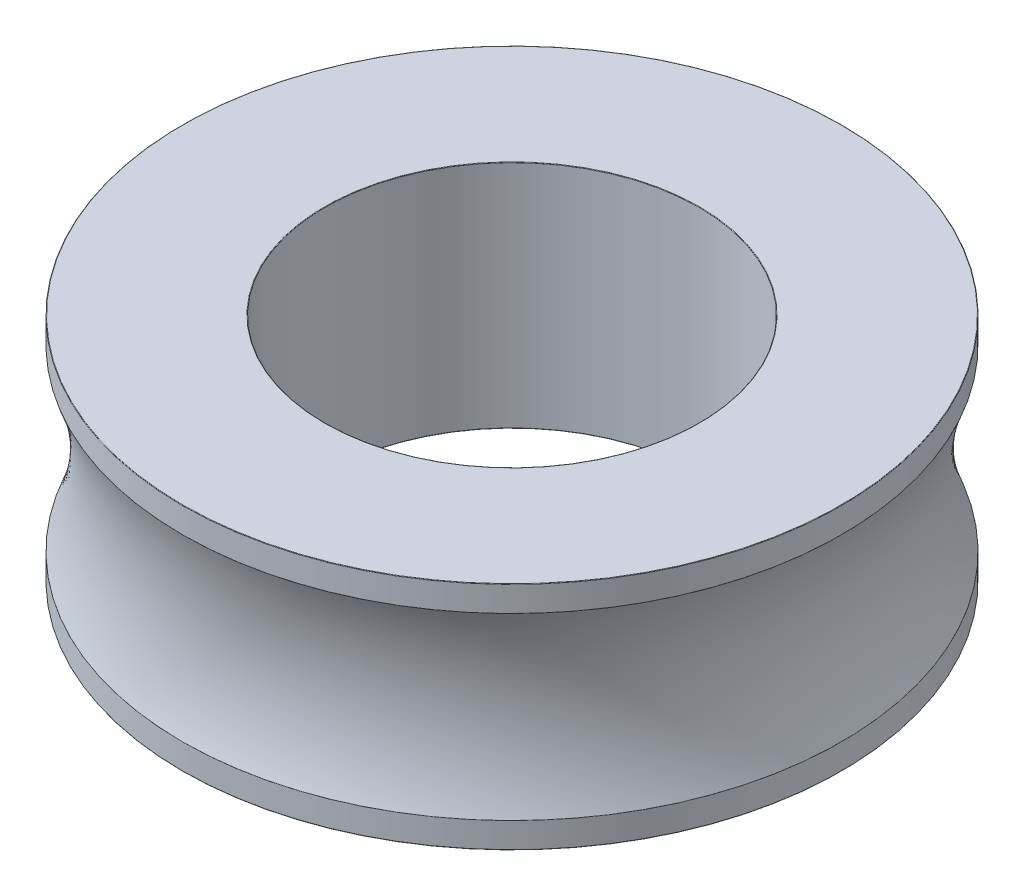
ISO-10303-21;
HEADER;
FILE_DESCRIPTION(('STEP AP214'),'2;1');
FILE_NAME('part.step','',(''),(''),'','','');
FILE_SCHEMA(('AUTOMOTIVE_DESIGN { 1 0 10303 214 1 1 1 1 }'));
ENDSEC;
DATA;
#1=APPLICATION_CONTEXT('core data for automotive mechanical design processes');
#2=APPLICATION_PROTOCOL_DEFINITION('international standard','automotive_design',2000,#1);
#3=PRODUCT_CONTEXT('',#1,'mechanical');
#4=PRODUCT('Part','Part','',(#3));
#5=PRODUCT_RELATED_PRODUCT_CATEGORY('part','',(#4));
#6=PRODUCT_DEFINITION_FORMATION('','',#4);
#7=PRODUCT_DEFINITION_CONTEXT('part definition',#1,'design');
#8=PRODUCT_DEFINITION('design','',#6,#7);
#9=PRODUCT_DEFINITION_SHAPE('','',#8);
#10=(LENGTH_UNIT() NAMED_UNIT(*) SI_UNIT(.MILLI.,.METRE.));
#11=(NAMED_UNIT(*) PLANE_ANGLE_UNIT() SI_UNIT($,.RADIAN.));
#12=(NAMED_UNIT(*) SI_UNIT($,.STERADIAN.) SOLID_ANGLE_UNIT());
#13=UNCERTAINTY_MEASURE_WITH_UNIT(LENGTH_MEASURE(1.E-05),#10,'distance_accuracy_value','');
#14=(GEOMETRIC_REPRESENTATION_CONTEXT(3) GLOBAL_UNCERTAINTY_ASSIGNED_CONTEXT((#13)) GLOBAL_UNIT_ASSIGNED_CONTEXT((#10,
#11,#12)) REPRESENTATION_CONTEXT('',''));
#15=CARTESIAN_POINT('',(0.,0.,0.));
#16=DIRECTION('',(0.,0.,1.));
#17=DIRECTION('',(1.,0.,0.));
#18=AXIS2_PLACEMENT_3D('',#15,#16,#17);
#19=CARTESIAN_POINT('',(0.,0.,0.));
#20=DIRECTION('',(0.,-1.,0.));
#21=DIRECTION('',(0.,0.,-1.));
#22=AXIS2_PLACEMENT_3D('',#19,#20,#21);
#23=CYLINDRICAL_SURFACE('',#22,28.1875);
#24=CARTESIAN_POINT('',(0.,0.0715873015873016,0.));
#25=DIRECTION('',(0.,-1.,0.));
#26=DIRECTION('',(0.,0.,-1.));
#27=AXIS2_PLACEMENT_3D('',#24,#25,#26);
#28=CIRCLE('',#27,28.1875);
#29=CARTESIAN_POINT('',(0.,0.0715873015873016,-28.1875));
#30=VERTEX_POINT('',#29);
#31=EDGE_CURVE('E69',#30,#30,#28,.T.);
#32=ORIENTED_EDGE('',*,*,#31,.T.);
#33=EDGE_LOOP('',(#32));
#34=FACE_BOUND('',#33,.T.);
#35=CARTESIAN_POINT('',(0.,34.6668055400474,0.));
#36=DIRECTION('',(0.,1.,0.));
#37=DIRECTION('',(0.,0.,1.));
#38=AXIS2_PLACEMENT_3D('',#35,#36,#37);
#39=CIRCLE('',#38,28.1875);
#40=CARTESIAN_POINT('',(0.,34.6668055400474,28.1875));
#41=VERTEX_POINT('',#40);
#42=EDGE_CURVE('E72',#41,#41,#39,.T.);
#43=ORIENTED_EDGE('',*,*,#42,.T.);
#44=EDGE_LOOP('',(#43));
#45=FACE_BOUND('',#44,.T.);
#46=ADVANCED_FACE('F31',(#34,#45),#23,.F.);
#47=CARTESIAN_POINT('',(28.1875,0.,0.));
#48=DIRECTION('',(0.,-1.,0.));
#49=DIRECTION('',(0.,0.,-1.));
#50=AXIS2_PLACEMENT_3D('',#47,#48,#49);
#51=PLANE('',#50);
#52=CARTESIAN_POINT('',(0.,0.,0.));
#53=DIRECTION('',(0.,-1.,0.));
#54=DIRECTION('',(0.,0.,-1.));
#55=AXIS2_PLACEMENT_3D('',#52,#53,#54);
#56=CIRCLE('',#55,28.2590873015873);
#57=CARTESIAN_POINT('',(0.,0.,-28.2590873015873));
#58=VERTEX_POINT('',#57);
#59=EDGE_CURVE('E63',#58,#58,#56,.F.);
#60=ORIENTED_EDGE('',*,*,#59,.T.);
#61=EDGE_LOOP('',(#60));
#62=FACE_BOUND('',#61,.T.);
#63=CARTESIAN_POINT('',(0.,0.,0.));
#64=DIRECTION('',(0.,-1.,0.));
#65=DIRECTION('',(0.,0.,-1.));
#66=AXIS2_PLACEMENT_3D('',#63,#64,#65);
#67=CIRCLE('',#66,49.5921031746032);
#68=CARTESIAN_POINT('',(0.,0.,-49.5921031746032));
#69=VERTEX_POINT('',#68);
#70=EDGE_CURVE('E66',#69,#69,#67,.T.);
#71=ORIENTED_EDGE('',*,*,#70,.T.);
#72=EDGE_LOOP('',(#71));
#73=FACE_BOUND('',#72,.T.);
#74=ADVANCED_FACE('F86',(#62,#73),#51,.T.);
#75=CARTESIAN_POINT('',(0.,0.,0.));
#76=DIRECTION('',(0.,-1.,0.));
#77=DIRECTION('',(0.,0.,-1.));
#78=AXIS2_PLACEMENT_3D('',#75,#76,#77);
#79=CYLINDRICAL_SURFACE('',#78,49.6636904761905);
#80=CARTESIAN_POINT('',(0.,0.0715873015873016,0.));
#81=DIRECTION('',(0.,-1.,0.));
#82=DIRECTION('',(0.,0.,-1.));
#83=AXIS2_PLACEMENT_3D('',#80,#81,#82);
#84=CIRCLE('',#83,49.6636904761905);
#85=CARTESIAN_POINT('',(0.,0.0715873015873016,-49.6636904761905));
#86=VERTEX_POINT('',#85);
#87=EDGE_CURVE('E57',#86,#86,#84,.F.);
#88=ORIENTED_EDGE('',*,*,#87,.T.);
#89=EDGE_LOOP('',(#88));
#90=FACE_BOUND('',#89,.T.);
#91=CARTESIAN_POINT('',(0.,3.84580057407766,0.));
#92=DIRECTION('',(0.,1.,0.));
#93=DIRECTION('',(0.,0.,1.));
#94=AXIS2_PLACEMENT_3D('',#91,#92,#93);
#95=CIRCLE('',#94,49.6636904761905);
#96=CARTESIAN_POINT('',(0.,3.84580057407766,49.6636904761905));
#97=VERTEX_POINT('',#96);
#98=EDGE_CURVE('E60',#97,#97,#95,.F.);
#99=ORIENTED_EDGE('',*,*,#98,.T.);
#100=EDGE_LOOP('',(#99));
#101=FACE_BOUND('',#100,.T.);
#102=ADVANCED_FACE('F92',(#90,#101),#79,.T.);
#103=CARTESIAN_POINT('',(0.,17.3691964208173,0.));
#104=DIRECTION('',(0.,-1.,0.));
#105=DIRECTION('',(0.,0.,-1.));
#106=AXIS2_PLACEMENT_3D('',#103,#104,#105);
#107=TOROIDAL_SURFACE('',#106,82.8100662127022,35.7936507936508);
#108=CARTESIAN_POINT('',(0.,3.87279338015899,0.));
#109=DIRECTION('',(0.,1.,0.));
#110=DIRECTION('',(0.,0.,1.));
#111=AXIS2_PLACEMENT_3D('',#108,#109,#110);
#112=CIRCLE('',#111,49.6584064940406);
#113=CARTESIAN_POINT('',(0.,3.87279338015899,49.6584064940406));
#114=VERTEX_POINT('',#113);
#115=EDGE_CURVE('E51',#114,#114,#112,.T.);
#116=ORIENTED_EDGE('',*,*,#115,.T.);
#117=EDGE_LOOP('',(#116));
#118=FACE_BOUND('',#117,.T.);
#119=CARTESIAN_POINT('',(0.,30.8655994614757,0.));
#120=DIRECTION('',(0.,-1.,0.));
#121=DIRECTION('',(0.,0.,-1.));
#122=AXIS2_PLACEMENT_3D('',#119,#120,#121);
#123=CIRCLE('',#122,49.6584064940406);
#124=CARTESIAN_POINT('',(0.,30.8655994614757,-49.6584064940406));
#125=VERTEX_POINT('',#124);
#126=EDGE_CURVE('E54',#125,#125,#123,.T.);
#127=ORIENTED_EDGE('',*,*,#126,.T.);
#128=EDGE_LOOP('',(#127));
#129=FACE_BOUND('',#128,.T.);
#130=ADVANCED_FACE('F118',(#118,#129),#107,.F.);
#131=CARTESIAN_POINT('',(0.,0.,0.));
#132=DIRECTION('',(0.,-1.,0.));
#133=DIRECTION('',(0.,0.,-1.));
#134=AXIS2_PLACEMENT_3D('',#131,#132,#133);
#135=CYLINDRICAL_SURFACE('',#134,49.6636904761905);
#136=CARTESIAN_POINT('',(0.,30.892592267557,0.));
#137=DIRECTION('',(0.,1.,0.));
#138=DIRECTION('',(0.,0.,1.));
#139=AXIS2_PLACEMENT_3D('',#136,#137,#138);
#140=CIRCLE('',#139,49.6636904761905);
#141=CARTESIAN_POINT('',(0.,30.892592267557,49.6636904761905));
#142=VERTEX_POINT('',#141);
#143=EDGE_CURVE('E42',#142,#142,#140,.T.);
#144=ORIENTED_EDGE('',*,*,#143,.T.);
#145=EDGE_LOOP('',(#144));
#146=FACE_BOUND('',#145,.T.);
#147=CARTESIAN_POINT('',(0.,34.6668055400474,0.));
#148=DIRECTION('',(0.,1.,0.));
#149=DIRECTION('',(0.,0.,1.));
#150=AXIS2_PLACEMENT_3D('',#147,#148,#149);
#151=CIRCLE('',#150,49.6636904761905);
#152=CARTESIAN_POINT('',(0.,34.6668055400474,49.6636904761905));
#153=VERTEX_POINT('',#152);
#154=EDGE_CURVE('E46',#153,#153,#151,.F.);
#155=ORIENTED_EDGE('',*,*,#154,.T.);
#156=EDGE_LOOP('',(#155));
#157=FACE_BOUND('',#156,.T.);
#158=ADVANCED_FACE('F120',(#146,#157),#135,.T.);
#159=CARTESIAN_POINT('',(49.6636904761905,34.7383928416347,0.));
#160=DIRECTION('',(0.,1.,0.));
#161=DIRECTION('',(0.,0.,1.));
#162=AXIS2_PLACEMENT_3D('',#159,#160,#161);
#163=PLANE('',#162);
#164=CARTESIAN_POINT('',(0.,34.7383928416347,0.));
#165=DIRECTION('',(0.,1.,0.));
#166=DIRECTION('',(0.,0.,1.));
#167=AXIS2_PLACEMENT_3D('',#164,#165,#166);
#168=CIRCLE('',#167,49.5921031746032);
#169=CARTESIAN_POINT('',(0.,34.7383928416347,49.5921031746032));
#170=VERTEX_POINT('',#169);
#171=EDGE_CURVE('E10',#170,#170,#168,.T.);
#172=ORIENTED_EDGE('',*,*,#171,.T.);
#173=EDGE_LOOP('',(#172));
#174=FACE_BOUND('',#173,.T.);
#175=CARTESIAN_POINT('',(0.,34.7383928416347,0.));
#176=DIRECTION('',(0.,1.,0.));
#177=DIRECTION('',(0.,0.,1.));
#178=AXIS2_PLACEMENT_3D('',#175,#176,#177);
#179=CIRCLE('',#178,28.2590873015873);
#180=CARTESIAN_POINT('',(0.,34.7383928416347,28.2590873015873));
#181=VERTEX_POINT('',#180);
#182=EDGE_CURVE('E38',#181,#181,#179,.F.);
#183=ORIENTED_EDGE('',*,*,#182,.T.);
#184=EDGE_LOOP('',(#183));
#185=FACE_BOUND('',#184,.T.);
#186=ADVANCED_FACE('F101',(#174,#185),#163,.T.);
#187=CARTESIAN_POINT('',(0.,0.0715873015873016,0.));
#188=DIRECTION('',(0.,-1.,0.));
#189=DIRECTION('',(0.,0.,-1.));
#190=AXIS2_PLACEMENT_3D('',#187,#188,#189);
#191=TOROIDAL_SURFACE('',#190,28.2590873015873,0.0715873015873016);
#192=ORIENTED_EDGE('',*,*,#59,.F.);
#193=EDGE_LOOP('',(#192));
#194=FACE_BOUND('',#193,.T.);
#195=ORIENTED_EDGE('',*,*,#31,.F.);
#196=EDGE_LOOP('',(#195));
#197=FACE_BOUND('',#196,.T.);
#198=ADVANCED_FACE('F97',(#194,#197),#191,.T.);
#199=CARTESIAN_POINT('',(0.,0.0715873015873016,0.));
#200=DIRECTION('',(0.,-1.,0.));
#201=DIRECTION('',(0.,0.,-1.));
#202=AXIS2_PLACEMENT_3D('',#199,#200,#201);
#203=TOROIDAL_SURFACE('',#202,49.5921031746032,0.0715873015873016);
#204=ORIENTED_EDGE('',*,*,#87,.F.);
#205=EDGE_LOOP('',(#204));
#206=FACE_BOUND('',#205,.T.);
#207=ORIENTED_EDGE('',*,*,#70,.F.);
#208=EDGE_LOOP('',(#207));
#209=FACE_BOUND('',#208,.T.);
#210=ADVANCED_FACE('F100',(#206,#209),#203,.T.);
#211=CARTESIAN_POINT('',(0.,3.84580057407766,0.));
#212=DIRECTION('',(0.,1.,0.));
#213=DIRECTION('',(0.,0.,1.));
#214=AXIS2_PLACEMENT_3D('',#211,#212,#213);
#215=TOROIDAL_SURFACE('',#214,49.5921031746032,0.0715873015873016);
#216=ORIENTED_EDGE('',*,*,#115,.F.);
#217=EDGE_LOOP('',(#216));
#218=FACE_BOUND('',#217,.T.);
#219=ORIENTED_EDGE('',*,*,#98,.F.);
#220=EDGE_LOOP('',(#219));
#221=FACE_BOUND('',#220,.T.);
#222=ADVANCED_FACE('F105',(#218,#221),#215,.T.);
#223=CARTESIAN_POINT('',(0.,30.892592267557,0.));
#224=DIRECTION('',(0.,1.,0.));
#225=DIRECTION('',(0.,0.,1.));
#226=AXIS2_PLACEMENT_3D('',#223,#224,#225);
#227=TOROIDAL_SURFACE('',#226,49.5921031746032,0.0715873015873016);
#228=ORIENTED_EDGE('',*,*,#143,.F.);
#229=EDGE_LOOP('',(#228));
#230=FACE_BOUND('',#229,.T.);
#231=ORIENTED_EDGE('',*,*,#126,.F.);
#232=EDGE_LOOP('',(#231));
#233=FACE_BOUND('',#232,.T.);
#234=ADVANCED_FACE('F83',(#230,#233),#227,.T.);
#235=CARTESIAN_POINT('',(0.,34.6668055400474,0.));
#236=DIRECTION('',(0.,1.,0.));
#237=DIRECTION('',(0.,0.,1.));
#238=AXIS2_PLACEMENT_3D('',#235,#236,#237);
#239=TOROIDAL_SURFACE('',#238,49.5921031746032,0.0715873015873016);
#240=ORIENTED_EDGE('',*,*,#171,.F.);
#241=EDGE_LOOP('',(#240));
#242=FACE_BOUND('',#241,.T.);
#243=ORIENTED_EDGE('',*,*,#154,.F.);
#244=EDGE_LOOP('',(#243));
#245=FACE_BOUND('',#244,.T.);
#246=ADVANCED_FACE('F79',(#242,#245),#239,.T.);
#247=CARTESIAN_POINT('',(0.,34.6668055400474,0.));
#248=DIRECTION('',(0.,1.,0.));
#249=DIRECTION('',(0.,0.,1.));
#250=AXIS2_PLACEMENT_3D('',#247,#248,#249);
#251=TOROIDAL_SURFACE('',#250,28.2590873015873,0.0715873015873016);
#252=ORIENTED_EDGE('',*,*,#42,.F.);
#253=EDGE_LOOP('',(#252));
#254=FACE_BOUND('',#253,.T.);
#255=ORIENTED_EDGE('',*,*,#182,.F.);
#256=EDGE_LOOP('',(#255));
#257=FACE_BOUND('',#256,.T.);
#258=ADVANCED_FACE('F33',(#254,#257),#251,.T.);
#259=CLOSED_SHELL('',(#46,#74,#102,#130,#158,#186,#198,#210,#222,#234,#246,#258));
#260=MANIFOLD_SOLID_BREP('B2',#259);
#261=ADVANCED_BREP_SHAPE_REPRESENTATION('',(#18,#260),#14);
#262=SHAPE_DEFINITION_REPRESENTATION(#9,#261);
ENDSEC;
END-ISO-10303-21;
